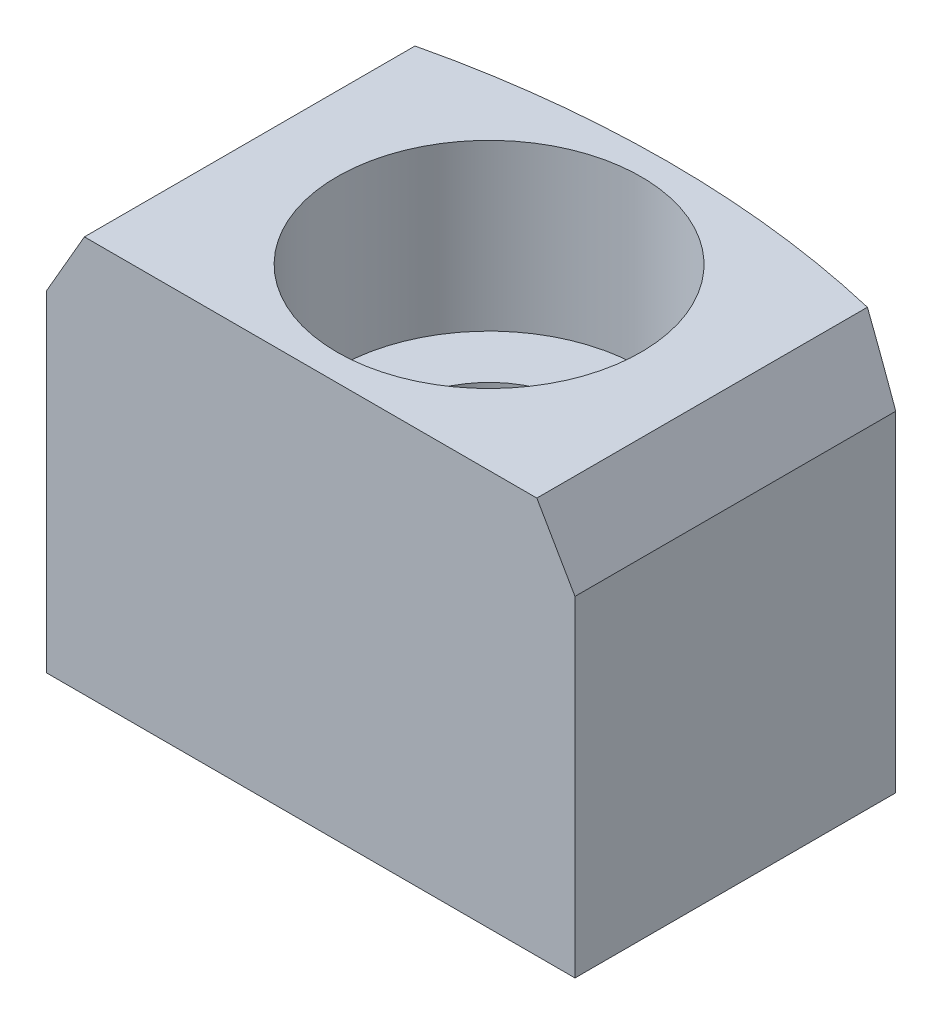
ISO-10303-21;
HEADER;
FILE_DESCRIPTION(('STEP AP214'),'2;1');
FILE_NAME('part.step','',(''),(''),'','','');
FILE_SCHEMA(('AUTOMOTIVE_DESIGN { 1 0 10303 214 1 1 1 1 }'));
ENDSEC;
DATA;
#1=APPLICATION_CONTEXT('core data for automotive mechanical design processes');
#2=APPLICATION_PROTOCOL_DEFINITION('international standard','automotive_design',2000,#1);
#3=PRODUCT_CONTEXT('',#1,'mechanical');
#4=PRODUCT('Part','Part','',(#3));
#5=PRODUCT_RELATED_PRODUCT_CATEGORY('part','',(#4));
#6=PRODUCT_DEFINITION_FORMATION('','',#4);
#7=PRODUCT_DEFINITION_CONTEXT('part definition',#1,'design');
#8=PRODUCT_DEFINITION('design','',#6,#7);
#9=PRODUCT_DEFINITION_SHAPE('','',#8);
#10=(LENGTH_UNIT() NAMED_UNIT(*) SI_UNIT(.MILLI.,.METRE.));
#11=(NAMED_UNIT(*) PLANE_ANGLE_UNIT() SI_UNIT($,.RADIAN.));
#12=(NAMED_UNIT(*) SI_UNIT($,.STERADIAN.) SOLID_ANGLE_UNIT());
#13=UNCERTAINTY_MEASURE_WITH_UNIT(LENGTH_MEASURE(1.E-05),#10,'distance_accuracy_value','');
#14=(GEOMETRIC_REPRESENTATION_CONTEXT(3) GLOBAL_UNCERTAINTY_ASSIGNED_CONTEXT((#13)) GLOBAL_UNIT_ASSIGNED_CONTEXT((#10,
#11,#12)) REPRESENTATION_CONTEXT('',''));
#15=CARTESIAN_POINT('',(0.,0.,0.));
#16=DIRECTION('',(0.,0.,1.));
#17=DIRECTION('',(1.,0.,0.));
#18=AXIS2_PLACEMENT_3D('',#15,#16,#17);
#19=CARTESIAN_POINT('',(-4.,3.,-3.));
#20=DIRECTION('',(1.,0.,0.));
#21=DIRECTION('',(0.,0.,-1.));
#22=AXIS2_PLACEMENT_3D('',#19,#20,#21);
#23=PLANE('',#22);
#24=DIRECTION('',(0.,1.,0.));
#25=VECTOR('',#24,1.);
#26=CARTESIAN_POINT('',(-4.,-3.,-2.15304845668682));
#27=LINE('',#26,#25);
#28=CARTESIAN_POINT('',(-4.,-3.,-2.15304845668682));
#29=VERTEX_POINT('',#28);
#30=CARTESIAN_POINT('',(-4.,2.,-2.15304845668683));
#31=VERTEX_POINT('',#30);
#32=EDGE_CURVE('E51',#29,#31,#27,.T.);
#33=ORIENTED_EDGE('',*,*,#32,.F.);
#34=DIRECTION('',(0.,0.,1.));
#35=VECTOR('',#34,1.);
#36=CARTESIAN_POINT('',(-4.,-3.,-3.));
#37=LINE('',#36,#35);
#38=CARTESIAN_POINT('',(-4.,-3.,2.7));
#39=VERTEX_POINT('',#38);
#40=EDGE_CURVE('E105',#29,#39,#37,.T.);
#41=ORIENTED_EDGE('',*,*,#40,.T.);
#42=DIRECTION('',(0.,-1.,0.));
#43=VECTOR('',#42,1.);
#44=CARTESIAN_POINT('',(-4.,3.,2.7));
#45=LINE('',#44,#43);
#46=CARTESIAN_POINT('',(-4.,2.,2.7));
#47=VERTEX_POINT('',#46);
#48=EDGE_CURVE('E121',#47,#39,#45,.T.);
#49=ORIENTED_EDGE('',*,*,#48,.F.);
#50=DIRECTION('',(0.,0.,-1.));
#51=VECTOR('',#50,1.);
#52=CARTESIAN_POINT('',(-4.,2.,-3.));
#53=LINE('',#52,#51);
#54=EDGE_CURVE('E44',#47,#31,#53,.T.);
#55=ORIENTED_EDGE('',*,*,#54,.T.);
#56=EDGE_LOOP('',(#33,#41,#49,#55));
#57=FACE_BOUND('',#56,.T.);
#58=ADVANCED_FACE('F36',(#57),#23,.F.);
#59=CARTESIAN_POINT('',(4.,3.,-3.));
#60=DIRECTION('',(-1.,0.,0.));
#61=DIRECTION('',(0.,0.,1.));
#62=AXIS2_PLACEMENT_3D('',#59,#60,#61);
#63=PLANE('',#62);
#64=DIRECTION('',(0.,1.,0.));
#65=VECTOR('',#64,1.);
#66=CARTESIAN_POINT('',(4.,-3.,-2.15304845668682));
#67=LINE('',#66,#65);
#68=CARTESIAN_POINT('',(4.,1.99999999999999,-2.15304845668682));
#69=VERTEX_POINT('',#68);
#70=CARTESIAN_POINT('',(4.,-3.,-2.15304845668682));
#71=VERTEX_POINT('',#70);
#72=EDGE_CURVE('E88',#69,#71,#67,.F.);
#73=ORIENTED_EDGE('',*,*,#72,.F.);
#74=DIRECTION('',(0.,0.,1.));
#75=VECTOR('',#74,1.);
#76=CARTESIAN_POINT('',(4.,1.99999999999999,2.7));
#77=LINE('',#76,#75);
#78=CARTESIAN_POINT('',(4.,1.99999999999999,2.7));
#79=VERTEX_POINT('',#78);
#80=EDGE_CURVE('E128',#69,#79,#77,.T.);
#81=ORIENTED_EDGE('',*,*,#80,.T.);
#82=DIRECTION('',(0.,-1.,0.));
#83=VECTOR('',#82,1.);
#84=CARTESIAN_POINT('',(4.,3.,2.7));
#85=LINE('',#84,#83);
#86=CARTESIAN_POINT('',(4.,-3.,2.7));
#87=VERTEX_POINT('',#86);
#88=EDGE_CURVE('E110',#79,#87,#85,.T.);
#89=ORIENTED_EDGE('',*,*,#88,.T.);
#90=DIRECTION('',(0.,0.,-1.));
#91=VECTOR('',#90,1.);
#92=CARTESIAN_POINT('',(4.,-3.,-3.));
#93=LINE('',#92,#91);
#94=EDGE_CURVE('E104',#87,#71,#93,.T.);
#95=ORIENTED_EDGE('',*,*,#94,.T.);
#96=EDGE_LOOP('',(#73,#81,#89,#95));
#97=FACE_BOUND('',#96,.T.);
#98=ADVANCED_FACE('F108',(#97),#63,.F.);
#99=CARTESIAN_POINT('',(-4.,3.,2.7));
#100=DIRECTION('',(0.,1.,0.));
#101=DIRECTION('',(0.,0.,1.));
#102=AXIS2_PLACEMENT_3D('',#99,#100,#101);
#103=PLANE('',#102);
#104=CARTESIAN_POINT('',(0.,3.,0.));
#105=DIRECTION('',(0.,1.,0.));
#106=DIRECTION('',(0.,0.,1.));
#107=AXIS2_PLACEMENT_3D('',#104,#105,#106);
#108=CIRCLE('',#107,2.3);
#109=CARTESIAN_POINT('',(0.,3.,2.3));
#110=VERTEX_POINT('',#109);
#111=EDGE_CURVE('E97',#110,#110,#108,.T.);
#112=ORIENTED_EDGE('',*,*,#111,.F.);
#113=EDGE_LOOP('',(#112));
#114=FACE_BOUND('',#113,.T.);
#115=DIRECTION('',(0.,0.,-1.));
#116=VECTOR('',#115,1.);
#117=CARTESIAN_POINT('',(3.42264973081037,3.,-3.));
#118=LINE('',#117,#116);
#119=CARTESIAN_POINT('',(3.42264973081037,3.,2.7));
#120=VERTEX_POINT('',#119);
#121=CARTESIAN_POINT('',(3.42264973081037,3.,-2.30156780559205));
#122=VERTEX_POINT('',#121);
#123=EDGE_CURVE('E125',#120,#122,#118,.T.);
#124=ORIENTED_EDGE('',*,*,#123,.T.);
#125=CARTESIAN_POINT('',(0.,3.,12.2));
#126=DIRECTION('',(0.,1.,0.));
#127=DIRECTION('',(0.,0.,1.));
#128=AXIS2_PLACEMENT_3D('',#125,#126,#127);
#129=CIRCLE('',#128,14.9);
#130=CARTESIAN_POINT('',(-3.42264973081038,3.,-2.30156780559205));
#131=VERTEX_POINT('',#130);
#132=EDGE_CURVE('E106',#122,#131,#129,.T.);
#133=ORIENTED_EDGE('',*,*,#132,.T.);
#134=DIRECTION('',(0.,0.,1.));
#135=VECTOR('',#134,1.);
#136=CARTESIAN_POINT('',(-3.42264973081037,3.,2.7));
#137=LINE('',#136,#135);
#138=CARTESIAN_POINT('',(-3.42264973081037,3.,2.7));
#139=VERTEX_POINT('',#138);
#140=EDGE_CURVE('E123',#131,#139,#137,.T.);
#141=ORIENTED_EDGE('',*,*,#140,.T.);
#142=DIRECTION('',(1.,0.,0.));
#143=VECTOR('',#142,1.);
#144=CARTESIAN_POINT('',(-4.,3.,2.7));
#145=LINE('',#144,#143);
#146=EDGE_CURVE('E112',#139,#120,#145,.T.);
#147=ORIENTED_EDGE('',*,*,#146,.T.);
#148=EDGE_LOOP('',(#124,#133,#141,#147));
#149=FACE_BOUND('',#148,.T.);
#150=ADVANCED_FACE('F139',(#114,#149),#103,.T.);
#151=CARTESIAN_POINT('',(-4.,-3.,2.7));
#152=DIRECTION('',(0.,1.,0.));
#153=DIRECTION('',(0.,0.,1.));
#154=AXIS2_PLACEMENT_3D('',#151,#152,#153);
#155=PLANE('',#154);
#156=CARTESIAN_POINT('',(0.,-3.,0.));
#157=DIRECTION('',(0.,1.,0.));
#158=DIRECTION('',(0.,0.,1.));
#159=AXIS2_PLACEMENT_3D('',#156,#157,#158);
#160=CIRCLE('',#159,1.35);
#161=CARTESIAN_POINT('',(0.,-3.,1.35));
#162=VERTEX_POINT('',#161);
#163=EDGE_CURVE('E153',#162,#162,#160,.T.);
#164=ORIENTED_EDGE('',*,*,#163,.T.);
#165=EDGE_LOOP('',(#164));
#166=FACE_BOUND('',#165,.T.);
#167=CARTESIAN_POINT('',(0.,-3.,12.2));
#168=DIRECTION('',(0.,1.,0.));
#169=DIRECTION('',(0.,0.,1.));
#170=AXIS2_PLACEMENT_3D('',#167,#168,#169);
#171=CIRCLE('',#170,14.9);
#172=EDGE_CURVE('E91',#71,#29,#171,.T.);
#173=ORIENTED_EDGE('',*,*,#172,.F.);
#174=ORIENTED_EDGE('',*,*,#94,.F.);
#175=DIRECTION('',(1.,0.,0.));
#176=VECTOR('',#175,1.);
#177=CARTESIAN_POINT('',(-4.,-3.,2.7));
#178=LINE('',#177,#176);
#179=EDGE_CURVE('E113',#39,#87,#178,.T.);
#180=ORIENTED_EDGE('',*,*,#179,.F.);
#181=ORIENTED_EDGE('',*,*,#40,.F.);
#182=EDGE_LOOP('',(#173,#174,#180,#181));
#183=FACE_BOUND('',#182,.T.);
#184=ADVANCED_FACE('F102',(#166,#183),#155,.F.);
#185=CARTESIAN_POINT('',(3.42264973081037,3.,2.7));
#186=DIRECTION('',(0.86602540378444,0.499999999999998,0.));
#187=DIRECTION('',(-0.499999999999998,0.86602540378444,0.));
#188=AXIS2_PLACEMENT_3D('',#185,#186,#187);
#189=PLANE('',#188);
#190=ORIENTED_EDGE('',*,*,#80,.F.);
#191=CARTESIAN_POINT('',(0.,8.92820323027554,12.2));
#192=DIRECTION('',(0.86602540378444,0.499999999999998,0.));
#193=DIRECTION('',(-0.499999999999998,0.86602540378444,0.));
#194=AXIS2_PLACEMENT_3D('',#191,#192,#193);
#195=ELLIPSE('',#194,29.8000000000001,14.9);
#196=EDGE_CURVE('E93',#69,#122,#195,.T.);
#197=ORIENTED_EDGE('',*,*,#196,.T.);
#198=ORIENTED_EDGE('',*,*,#123,.F.);
#199=DIRECTION('',(-0.499999999999998,0.86602540378444,0.));
#200=VECTOR('',#199,1.);
#201=CARTESIAN_POINT('',(3.42264973081037,3.,2.7));
#202=LINE('',#201,#200);
#203=EDGE_CURVE('E131',#79,#120,#202,.T.);
#204=ORIENTED_EDGE('',*,*,#203,.F.);
#205=EDGE_LOOP('',(#190,#197,#198,#204));
#206=FACE_BOUND('',#205,.T.);
#207=ADVANCED_FACE('F158',(#206),#189,.T.);
#208=CARTESIAN_POINT('',(-3.42264973081037,3.,2.7));
#209=DIRECTION('',(-0.86602540378444,0.499999999999998,0.));
#210=DIRECTION('',(-0.499999999999998,-0.86602540378444,0.));
#211=AXIS2_PLACEMENT_3D('',#208,#209,#210);
#212=PLANE('',#211);
#213=ORIENTED_EDGE('',*,*,#140,.F.);
#214=CARTESIAN_POINT('',(0.,8.92820323027554,12.2));
#215=DIRECTION('',(-0.86602540378444,0.499999999999998,0.));
#216=DIRECTION('',(0.499999999999998,0.86602540378444,0.));
#217=AXIS2_PLACEMENT_3D('',#214,#215,#216);
#218=ELLIPSE('',#217,29.8000000000001,14.9);
#219=EDGE_CURVE('E11',#131,#31,#218,.T.);
#220=ORIENTED_EDGE('',*,*,#219,.T.);
#221=ORIENTED_EDGE('',*,*,#54,.F.);
#222=DIRECTION('',(-0.499999999999998,-0.86602540378444,0.));
#223=VECTOR('',#222,1.);
#224=CARTESIAN_POINT('',(-3.42264973081037,3.,2.7));
#225=LINE('',#224,#223);
#226=EDGE_CURVE('E58',#139,#47,#225,.T.);
#227=ORIENTED_EDGE('',*,*,#226,.F.);
#228=EDGE_LOOP('',(#213,#220,#221,#227));
#229=FACE_BOUND('',#228,.T.);
#230=ADVANCED_FACE('F38',(#229),#212,.T.);
#231=CARTESIAN_POINT('',(-4.,3.,2.7));
#232=DIRECTION('',(0.,0.,-1.));
#233=DIRECTION('',(-1.,0.,0.));
#234=AXIS2_PLACEMENT_3D('',#231,#232,#233);
#235=PLANE('',#234);
#236=ORIENTED_EDGE('',*,*,#88,.F.);
#237=ORIENTED_EDGE('',*,*,#203,.T.);
#238=ORIENTED_EDGE('',*,*,#146,.F.);
#239=ORIENTED_EDGE('',*,*,#226,.T.);
#240=ORIENTED_EDGE('',*,*,#48,.T.);
#241=ORIENTED_EDGE('',*,*,#179,.T.);
#242=EDGE_LOOP('',(#236,#237,#238,#239,#240,#241));
#243=FACE_BOUND('',#242,.T.);
#244=ADVANCED_FACE('F155',(#243),#235,.F.);
#245=CARTESIAN_POINT('',(0.,3.,0.));
#246=DIRECTION('',(0.,1.,0.));
#247=DIRECTION('',(0.,0.,1.));
#248=AXIS2_PLACEMENT_3D('',#245,#246,#247);
#249=CYLINDRICAL_SURFACE('',#248,1.35);
#250=ORIENTED_EDGE('',*,*,#163,.F.);
#251=EDGE_LOOP('',(#250));
#252=FACE_BOUND('',#251,.T.);
#253=CARTESIAN_POINT('',(0.,0.5,0.));
#254=DIRECTION('',(0.,1.,0.));
#255=DIRECTION('',(0.,0.,1.));
#256=AXIS2_PLACEMENT_3D('',#253,#254,#255);
#257=CIRCLE('',#256,1.35);
#258=CARTESIAN_POINT('',(0.,0.5,1.35));
#259=VERTEX_POINT('',#258);
#260=EDGE_CURVE('E150',#259,#259,#257,.T.);
#261=ORIENTED_EDGE('',*,*,#260,.T.);
#262=EDGE_LOOP('',(#261));
#263=FACE_BOUND('',#262,.T.);
#264=ADVANCED_FACE('F174',(#252,#263),#249,.F.);
#265=CARTESIAN_POINT('',(1.35,0.5,0.));
#266=DIRECTION('',(0.,-1.,0.));
#267=DIRECTION('',(0.,0.,-1.));
#268=AXIS2_PLACEMENT_3D('',#265,#266,#267);
#269=PLANE('',#268);
#270=ORIENTED_EDGE('',*,*,#260,.F.);
#271=EDGE_LOOP('',(#270));
#272=FACE_BOUND('',#271,.T.);
#273=CARTESIAN_POINT('',(0.,0.5,0.));
#274=DIRECTION('',(0.,1.,0.));
#275=DIRECTION('',(0.,0.,1.));
#276=AXIS2_PLACEMENT_3D('',#273,#274,#275);
#277=CIRCLE('',#276,2.3);
#278=CARTESIAN_POINT('',(0.,0.5,2.3));
#279=VERTEX_POINT('',#278);
#280=EDGE_CURVE('E147',#279,#279,#277,.T.);
#281=ORIENTED_EDGE('',*,*,#280,.T.);
#282=EDGE_LOOP('',(#281));
#283=FACE_BOUND('',#282,.T.);
#284=ADVANCED_FACE('F181',(#272,#283),#269,.F.);
#285=CARTESIAN_POINT('',(0.,3.,0.));
#286=DIRECTION('',(0.,1.,0.));
#287=DIRECTION('',(0.,0.,1.));
#288=AXIS2_PLACEMENT_3D('',#285,#286,#287);
#289=CYLINDRICAL_SURFACE('',#288,2.3);
#290=ORIENTED_EDGE('',*,*,#280,.F.);
#291=EDGE_LOOP('',(#290));
#292=FACE_BOUND('',#291,.T.);
#293=ORIENTED_EDGE('',*,*,#111,.T.);
#294=EDGE_LOOP('',(#293));
#295=FACE_BOUND('',#294,.T.);
#296=ADVANCED_FACE('F185',(#292,#295),#289,.F.);
#297=CARTESIAN_POINT('',(0.,-3.,12.2));
#298=DIRECTION('',(0.,1.,0.));
#299=DIRECTION('',(0.,0.,1.));
#300=AXIS2_PLACEMENT_3D('',#297,#298,#299);
#301=CYLINDRICAL_SURFACE('',#300,14.9);
#302=ORIENTED_EDGE('',*,*,#72,.T.);
#303=ORIENTED_EDGE('',*,*,#172,.T.);
#304=ORIENTED_EDGE('',*,*,#32,.T.);
#305=ORIENTED_EDGE('',*,*,#219,.F.);
#306=ORIENTED_EDGE('',*,*,#132,.F.);
#307=ORIENTED_EDGE('',*,*,#196,.F.);
#308=EDGE_LOOP('',(#302,#303,#304,#305,#306,#307));
#309=FACE_BOUND('',#308,.T.);
#310=ADVANCED_FACE('F90',(#309),#301,.T.);
#311=CLOSED_SHELL('',(#58,#98,#150,#184,#207,#230,#244,#264,#284,#296,#310));
#312=MANIFOLD_SOLID_BREP('B2',#311);
#313=ADVANCED_BREP_SHAPE_REPRESENTATION('',(#18,#312),#14);
#314=SHAPE_DEFINITION_REPRESENTATION(#9,#313);
ENDSEC;
END-ISO-10303-21;
